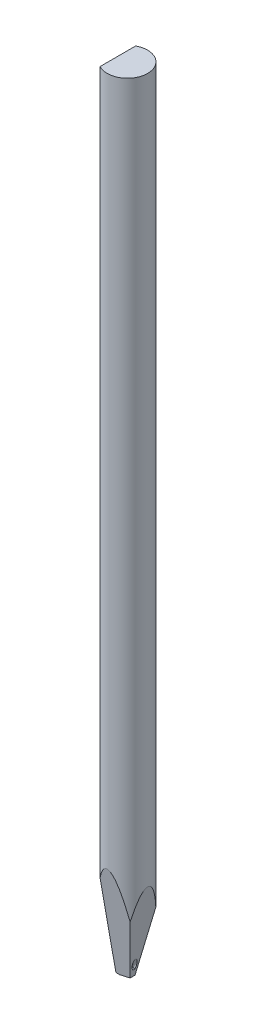
ISO-10303-21;
HEADER;
FILE_DESCRIPTION(('STEP AP214'),'2;1');
FILE_NAME('part.step','',(''),(''),'','','');
FILE_SCHEMA(('AUTOMOTIVE_DESIGN { 1 0 10303 214 1 1 1 1 }'));
ENDSEC;
DATA;
#1=APPLICATION_CONTEXT('core data for automotive mechanical design processes');
#2=APPLICATION_PROTOCOL_DEFINITION('international standard','automotive_design',2000,#1);
#3=PRODUCT_CONTEXT('',#1,'mechanical');
#4=PRODUCT('Part','Part','',(#3));
#5=PRODUCT_RELATED_PRODUCT_CATEGORY('part','',(#4));
#6=PRODUCT_DEFINITION_FORMATION('','',#4);
#7=PRODUCT_DEFINITION_CONTEXT('part definition',#1,'design');
#8=PRODUCT_DEFINITION('design','',#6,#7);
#9=PRODUCT_DEFINITION_SHAPE('','',#8);
#10=(LENGTH_UNIT() NAMED_UNIT(*) SI_UNIT(.MILLI.,.METRE.));
#11=(NAMED_UNIT(*) PLANE_ANGLE_UNIT() SI_UNIT($,.RADIAN.));
#12=(NAMED_UNIT(*) SI_UNIT($,.STERADIAN.) SOLID_ANGLE_UNIT());
#13=UNCERTAINTY_MEASURE_WITH_UNIT(LENGTH_MEASURE(1.E-05),#10,'distance_accuracy_value','');
#14=(GEOMETRIC_REPRESENTATION_CONTEXT(3) GLOBAL_UNCERTAINTY_ASSIGNED_CONTEXT((#13)) GLOBAL_UNIT_ASSIGNED_CONTEXT((#10,
#11,#12)) REPRESENTATION_CONTEXT('',''));
#15=CARTESIAN_POINT('',(0.,0.,0.));
#16=DIRECTION('',(0.,0.,1.));
#17=DIRECTION('',(1.,0.,0.));
#18=AXIS2_PLACEMENT_3D('',#15,#16,#17);
#19=CARTESIAN_POINT('',(39.4414537636428,0.,0.0762));
#20=DIRECTION('',(0.,-0.173648177666931,0.984807753012208));
#21=DIRECTION('',(0.,-0.984807753012208,-0.173648177666931));
#22=AXIS2_PLACEMENT_3D('',#19,#20,#21);
#23=PLANE('',#22);
#24=CARTESIAN_POINT('',(-0.32004,0.05588,0.086053151681989));
#25=DIRECTION('',(0.,-0.173648177666931,0.984807753012208));
#26=DIRECTION('',(0.,-0.984807753012208,-0.173648177666931));
#27=AXIS2_PLACEMENT_3D('',#24,#25,#26);
#28=ELLIPSE('',#27,0.0567420390721754,0.05588);
#29=CARTESIAN_POINT('',(-0.32004,0.,0.0761999999999999));
#30=VERTEX_POINT('',#29);
#31=CARTESIAN_POINT('',(-0.37592,0.05588,0.086053151681989));
#32=VERTEX_POINT('',#31);
#33=EDGE_CURVE('E358',#30,#32,#28,.F.);
#34=ORIENTED_EDGE('',*,*,#33,.F.);
#35=DIRECTION('',(-1.,0.,0.));
#36=VECTOR('',#35,1.);
#37=CARTESIAN_POINT('',(39.4414537636428,0.,0.0762));
#38=LINE('',#37,#36);
#39=CARTESIAN_POINT('',(-0.223520000000001,0.,0.0762000000000001));
#40=VERTEX_POINT('',#39);
#41=EDGE_CURVE('E420',#40,#30,#38,.T.);
#42=ORIENTED_EDGE('',*,*,#41,.F.);
#43=DIRECTION('',(-0.964921520309631,-0.258549942126377,-0.0455893306574928));
#44=VECTOR('',#43,1.);
#45=CARTESIAN_POINT('',(36.7074875502685,9.89563364876217,1.82106720348333));
#46=LINE('',#45,#44);
#47=CARTESIAN_POINT('',(0.203033220117547,0.114294590859393,0.0963532201175461));
#48=VERTEX_POINT('',#47);
#49=EDGE_CURVE('E417',#48,#40,#46,.T.);
#50=ORIENTED_EDGE('',*,*,#49,.F.);
#51=DIRECTION('',(-0.171087869746036,-0.970287525247814,-0.171087869746036));
#52=VECTOR('',#51,1.);
#53=CARTESIAN_POINT('',(1.33202003573172,6.51709699284012,1.22534003573172));
#54=LINE('',#53,#52);
#55=CARTESIAN_POINT('',(0.611163555974466,2.4289167446392,0.504483555974466));
#56=VERTEX_POINT('',#55);
#57=EDGE_CURVE('E414',#56,#48,#54,.T.);
#58=ORIENTED_EDGE('',*,*,#57,.F.);
#59=CARTESIAN_POINT('',(0.,-0.432151674654869,0.));
#60=DIRECTION('',(0.,-0.173648177666931,0.984807753012208));
#61=DIRECTION('',(0.,-0.984807753012208,-0.173648177666931));
#62=AXIS2_PLACEMENT_3D('',#59,#60,#61);
#63=ELLIPSE('',#62,4.56371043248163,0.792479999999998);
#64=CARTESIAN_POINT('',(-0.37592,3.52439037249585,0.69764511322018));
#65=VERTEX_POINT('',#64);
#66=EDGE_CURVE('E425',#56,#65,#63,.T.);
#67=ORIENTED_EDGE('',*,*,#66,.T.);
#68=DIRECTION('',(0.,0.984807753012208,0.173648177666931));
#69=VECTOR('',#68,1.);
#70=CARTESIAN_POINT('',(-0.37592,30.0265048215283,5.37068293640828));
#71=LINE('',#70,#69);
#72=EDGE_CURVE('E440',#32,#65,#71,.T.);
#73=ORIENTED_EDGE('',*,*,#72,.F.);
#74=EDGE_LOOP('',(#34,#42,#50,#58,#67,#73));
#75=FACE_BOUND('',#74,.T.);
#76=ADVANCED_FACE('F46',(#75),#23,.T.);
#77=CARTESIAN_POINT('',(39.4414537636428,0.,-0.0762));
#78=DIRECTION('',(0.,-0.173648177666931,-0.984807753012208));
#79=DIRECTION('',(0.,0.984807753012208,-0.173648177666931));
#80=AXIS2_PLACEMENT_3D('',#77,#78,#79);
#81=PLANE('',#80);
#82=CARTESIAN_POINT('',(-0.32004,0.05588,-0.086053151681989));
#83=DIRECTION('',(0.,-0.173648177666931,-0.984807753012208));
#84=DIRECTION('',(0.,0.984807753012208,-0.173648177666931));
#85=AXIS2_PLACEMENT_3D('',#82,#83,#84);
#86=ELLIPSE('',#85,0.0567420390721754,0.05588);
#87=CARTESIAN_POINT('',(-0.37592,0.05588,-0.086053151681989));
#88=VERTEX_POINT('',#87);
#89=CARTESIAN_POINT('',(-0.32004,0.,-0.0761999999999999));
#90=VERTEX_POINT('',#89);
#91=EDGE_CURVE('E463',#88,#90,#86,.F.);
#92=ORIENTED_EDGE('',*,*,#91,.F.);
#93=DIRECTION('',(0.,-0.984807753012208,0.173648177666931));
#94=VECTOR('',#93,1.);
#95=CARTESIAN_POINT('',(-0.37592,30.3009691393038,-5.41907840087385));
#96=LINE('',#95,#94);
#97=CARTESIAN_POINT('',(-0.37592,3.52439037249586,-0.69764511322018));
#98=VERTEX_POINT('',#97);
#99=EDGE_CURVE('E442',#98,#88,#96,.T.);
#100=ORIENTED_EDGE('',*,*,#99,.F.);
#101=CARTESIAN_POINT('',(0.,-0.432151674654869,0.));
#102=DIRECTION('',(0.,-0.173648177666931,-0.984807753012208));
#103=DIRECTION('',(0.,-0.984807753012208,0.173648177666931));
#104=AXIS2_PLACEMENT_3D('',#101,#102,#103);
#105=ELLIPSE('',#104,4.56371043248163,0.792479999999998);
#106=CARTESIAN_POINT('',(0.611163555974466,2.4289167446392,-0.504483555974466));
#107=VERTEX_POINT('',#106);
#108=EDGE_CURVE('E428',#98,#107,#105,.T.);
#109=ORIENTED_EDGE('',*,*,#108,.T.);
#110=DIRECTION('',(0.171087869746036,0.970287525247814,-0.171087869746036));
#111=VECTOR('',#110,1.);
#112=CARTESIAN_POINT('',(1.33202003573172,6.51709699284012,-1.22534003573172));
#113=LINE('',#112,#111);
#114=CARTESIAN_POINT('',(0.203033220117547,0.114294590859393,-0.0963532201175461));
#115=VERTEX_POINT('',#114);
#116=EDGE_CURVE('E445',#115,#107,#113,.T.);
#117=ORIENTED_EDGE('',*,*,#116,.F.);
#118=DIRECTION('',(0.964921520309631,0.258549942126377,-0.0455893306574928));
#119=VECTOR('',#118,1.);
#120=CARTESIAN_POINT('',(36.7074875502685,9.89563364876217,-1.82106720348333));
#121=LINE('',#120,#119);
#122=CARTESIAN_POINT('',(-0.223520000000001,0.,-0.0762000000000001));
#123=VERTEX_POINT('',#122);
#124=EDGE_CURVE('E448',#123,#115,#121,.T.);
#125=ORIENTED_EDGE('',*,*,#124,.F.);
#126=DIRECTION('',(-1.,0.,0.));
#127=VECTOR('',#126,1.);
#128=CARTESIAN_POINT('',(39.4414537636428,0.,-0.0762));
#129=LINE('',#128,#127);
#130=EDGE_CURVE('E422',#123,#90,#129,.T.);
#131=ORIENTED_EDGE('',*,*,#130,.T.);
#132=EDGE_LOOP('',(#92,#100,#109,#117,#125,#131));
#133=FACE_BOUND('',#132,.T.);
#134=ADVANCED_FACE('F261',(#133),#81,.T.);
#135=CARTESIAN_POINT('',(39.2509537636428,-0.217680032,0.));
#136=DIRECTION('',(-1.,0.,0.));
#137=DIRECTION('',(0.,0.,1.));
#138=AXIS2_PLACEMENT_3D('',#135,#136,#137);
#139=CYLINDRICAL_SURFACE('',#138,0.22352);
#140=DIRECTION('',(-1.,0.,0.));
#141=VECTOR('',#140,1.);
#142=CARTESIAN_POINT('',(39.2509537636428,0.,0.0507601622188008));
#143=LINE('',#142,#141);
#144=CARTESIAN_POINT('',(-0.223519999999998,0.,0.0507601622188008));
#145=VERTEX_POINT('',#144);
#146=CARTESIAN_POINT('',(-0.32004,0.,0.0507601622187993));
#147=VERTEX_POINT('',#146);
#148=EDGE_CURVE('E226',#145,#147,#143,.T.);
#149=ORIENTED_EDGE('',*,*,#148,.T.);
#150=CARTESIAN_POINT('',(-0.32004,0.,0.0507601622188009));
#151=CARTESIAN_POINT('',(-0.320809475439347,-5.41041296015965E-07,0.0507620071604706));
#152=CARTESIAN_POINT('',(-0.321576800282668,1.5871895672045E-05,0.050692115938631));
#153=CARTESIAN_POINT('',(-0.323080877945855,7.79165019076629E-05,0.0504251621910984));
#154=CARTESIAN_POINT('',(-0.323817846077235,0.000123279767180408,0.0502292677351534));
#155=CARTESIAN_POINT('',(-0.325247431761082,0.000238505043902202,0.0497268831541668));
#156=CARTESIAN_POINT('',(-0.32594018272157,0.000308288799525646,0.0494207462128683));
#157=CARTESIAN_POINT('',(-0.327276847370732,0.000466504775771173,0.0487176644362897));
#158=CARTESIAN_POINT('',(-0.327920638607172,0.000554981790321569,0.0483205012810623));
#159=CARTESIAN_POINT('',(-0.329593275221739,0.000812282763806549,0.0471472618074019));
#160=CARTESIAN_POINT('',(-0.330571678746111,0.000993612063422425,0.0463021208742925));
#161=CARTESIAN_POINT('',(-0.332385248633484,0.00137286068933092,0.04447365071426));
#162=CARTESIAN_POINT('',(-0.333219984012656,0.00157082736981463,0.0434899212585391));
#163=CARTESIAN_POINT('',(-0.335345578252586,0.00211859988673764,0.0406581114295598));
#164=CARTESIAN_POINT('',(-0.336508686454995,0.00247087329222261,0.0387153496579219));
#165=CARTESIAN_POINT('',(-0.33854573765277,0.00314258983066577,0.0346815872372509));
#166=CARTESIAN_POINT('',(-0.339418997502717,0.0034619541966496,0.0325902502855744));
#167=CARTESIAN_POINT('',(-0.341596334336846,0.00430206882658854,0.0264787227515104));
#168=CARTESIAN_POINT('',(-0.342622185401764,0.00475887805797586,0.0223509389944154));
#169=CARTESIAN_POINT('',(-0.344107303512625,0.00544265456112021,0.0139757220926114));
#170=CARTESIAN_POINT('',(-0.34456488861004,0.00566893917471365,0.00972797163831547));
#171=CARTESIAN_POINT('',(-0.345004758810726,0.00588589993718082,0.000852646654595291));
#172=CARTESIAN_POINT('',(-0.344945012421054,0.00585574451986179,-0.00377752303026068));
#173=CARTESIAN_POINT('',(-0.344240777632389,0.00551043791740716,-0.0129683265767084));
#174=CARTESIAN_POINT('',(-0.343598877957902,0.00519654846373034,-0.0175291774761781));
#175=CARTESIAN_POINT('',(-0.342186290137468,0.0045741223651413,-0.023826542249816));
#176=CARTESIAN_POINT('',(-0.341714874305335,0.00437162733718365,-0.0256422391028256));
#177=CARTESIAN_POINT('',(-0.340627957746504,0.00392750723650701,-0.0292328652612556));
#178=CARTESIAN_POINT('',(-0.340011976430116,0.00368575249410048,-0.0310076364173655));
#179=CARTESIAN_POINT('',(-0.338407729485797,0.0030960667307467,-0.0349891355893685));
#180=CARTESIAN_POINT('',(-0.33736331269008,0.00273766008525308,-0.0371721555483447));
#181=CARTESIAN_POINT('',(-0.334905960523153,0.00199828653899547,-0.041315195895506));
#182=CARTESIAN_POINT('',(-0.333495616225528,0.00161749226507164,-0.0432766503272211));
#183=CARTESIAN_POINT('',(-0.331200806954028,0.00112210848421275,-0.0456870946574725));
#184=CARTESIAN_POINT('',(-0.33052257932814,0.000987199146508853,-0.046327180625344));
#185=CARTESIAN_POINT('',(-0.329085205149441,0.000732066396515359,-0.0475153538951638));
#186=CARTESIAN_POINT('',(-0.328326017912602,0.00061185043371845,-0.0480633945827042));
#187=CARTESIAN_POINT('',(-0.326716292347034,0.000394246892643618,-0.0490413681859921));
#188=CARTESIAN_POINT('',(-0.32586466388685,0.000297187662007648,-0.0494696156608001));
#189=CARTESIAN_POINT('',(-0.324093197121016,0.000140193099000938,-0.0501564294225165));
#190=CARTESIAN_POINT('',(-0.323173640938966,8.01129292474691E-05,-0.0504156579526773));
#191=CARTESIAN_POINT('',(-0.321874914124203,2.89381809600572E-05,-0.0506359338031454));
#192=CARTESIAN_POINT('',(-0.32150984236334,1.81302289830031E-05,-0.050682362340871));
#193=CARTESIAN_POINT('',(-0.32077659939215,3.65242935722097E-06,-0.0507445040489149));
#194=CARTESIAN_POINT('',(-0.320408425496098,-1.04159337815038E-08,-0.0507601870880603));
#195=CARTESIAN_POINT('',(-0.320040000000259,0.,-0.0507601622203182));
#196=B_SPLINE_CURVE_WITH_KNOTS('',3,(#150,#151,#152,#153,#154,#155,#156,#157,#158,#159,#160,
#161,#162,#163,#164,#165,#166,#167,#168,#169,#170,#171,#172,#173,#174,#175,#176,#177,#178,#179,
#180,#181,#182,#183,#184,#185,#186,#187,#188,#189,#190,#191,#192,#193,#194,#195),.UNSPECIFIED.,
.F.,.F.,(4,2,2,2,2,2,2,2,2,2,2,2,2,2,2,2,2,2,2,2,2,2,4),(0.,0.00230166702394006,
0.00458229886576195,0.00685568831982713,0.00913458848021843,0.0130284670320873,
0.016933830425893,0.0237697103353728,0.0306215892230504,0.0433843744426046,0.0561848454987028,
0.0700344921085309,0.0838228523462301,0.089478541101295,0.0951533046761938,0.102471060476781,
0.109738351075717,0.112559031674474,0.115381136468608,0.118241150761547,0.121089890625289,
0.122193253621969,0.123297697395864),.UNSPECIFIED.);
#197=CARTESIAN_POINT('',(-0.341569991325016,0.00431417921200177,0.0260574382161684));
#198=VERTEX_POINT('',#197);
#199=EDGE_CURVE('E224',#147,#198,#196,.T.);
#200=ORIENTED_EDGE('',*,*,#199,.T.);
#201=CARTESIAN_POINT('',(-0.37592,0.,-0.0507601622188007));
#202=CARTESIAN_POINT('',(-0.350517897671708,0.00387563047875049,-0.0341398968422236));
#203=CARTESIAN_POINT('',(-0.325119999999998,0.00583996800000001,-0.0170689128963833));
#204=CARTESIAN_POINT('',(-0.325119999999998,0.005839968,0.0170689128963834));
#205=CARTESIAN_POINT('',(-0.350517897671708,0.00387563047875052,0.0341398968422234));
#206=CARTESIAN_POINT('',(-0.37592,0.,0.0507601622188008));
#207=(BOUNDED_CURVE() B_SPLINE_CURVE(3,(#201,#202,#203,#204,#205,#206),.UNSPECIFIED.,.F.,
.F.) B_SPLINE_CURVE_WITH_KNOTS((4,2,4),(1.34170313821549,1.5707963267949,1.7998895153743),
.UNSPECIFIED.) CURVE() GEOMETRIC_REPRESENTATION_ITEM() RATIONAL_B_SPLINE_CURVE((1.,1.,1.,1.,1.,1.)) REPRESENTATION_ITEM(''));
#208=CARTESIAN_POINT('',(-0.341570424931193,0.00431507737605475,-0.0260571786900659));
#209=VERTEX_POINT('',#208);
#210=EDGE_CURVE('E213',#198,#209,#207,.F.);
#211=ORIENTED_EDGE('',*,*,#210,.T.);
#212=CARTESIAN_POINT('',(-0.32004,0.,-0.0507601622187993));
#213=VERTEX_POINT('',#212);
#214=EDGE_CURVE('E227',#209,#213,#196,.T.);
#215=ORIENTED_EDGE('',*,*,#214,.T.);
#216=DIRECTION('',(-1.,0.,0.));
#217=VECTOR('',#216,1.);
#218=CARTESIAN_POINT('',(39.2509537636428,0.,-0.0507601622188009));
#219=LINE('',#218,#217);
#220=CARTESIAN_POINT('',(-0.22352,0.,-0.0507601622187909));
#221=VERTEX_POINT('',#220);
#222=EDGE_CURVE('E299',#221,#213,#219,.T.);
#223=ORIENTED_EDGE('',*,*,#222,.F.);
#224=CARTESIAN_POINT('',(-1.03591293921722,-0.217680032,0.));
#225=DIRECTION('',(-0.258819045102522,0.965925826289068,0.));
#226=DIRECTION('',(-0.965925826289068,-0.258819045102522,0.));
#227=AXIS2_PLACEMENT_3D('',#224,#225,#226);
#228=ELLIPSE('',#227,0.863614962768528,0.22352);
#229=CARTESIAN_POINT('',(-0.21260720632451,0.00292407425251634,-0.0359863683153587));
#230=VERTEX_POINT('',#229);
#231=EDGE_CURVE('E450',#230,#221,#228,.T.);
#232=ORIENTED_EDGE('',*,*,#231,.F.);
#233=CARTESIAN_POINT('',(-0.200679772365681,0.00257805575643269,-0.0380468813160764));
#234=CARTESIAN_POINT('',(-0.203236281086819,0.00259681610478001,-0.0379307129945415));
#235=CARTESIAN_POINT('',(-0.20578763073782,0.00265241023420206,-0.0376154914849817));
#236=CARTESIAN_POINT('',(-0.210815610182838,0.00282831237674686,-0.0365745620891434));
#237=CARTESIAN_POINT('',(-0.213291799770585,0.00294894437521597,-0.035846798186715));
#238=CARTESIAN_POINT('',(-0.218086714182621,0.00324614492953906,-0.0339658644914402));
#239=CARTESIAN_POINT('',(-0.220404817441722,0.00342292037866237,-0.0328111186074336));
#240=CARTESIAN_POINT('',(-0.224776468273895,0.00380971561444363,-0.0300893083720762));
#241=CARTESIAN_POINT('',(-0.226830640788004,0.00401965414441562,-0.0285232457767758));
#242=CARTESIAN_POINT('',(-0.230396900654561,0.00442144881246551,-0.0251919332329743));
#243=CARTESIAN_POINT('',(-0.23194279985924,0.0046129866444759,-0.0234628410940604));
#244=CARTESIAN_POINT('',(-0.234689041383704,0.00497390416758029,-0.0197455957490929));
#245=CARTESIAN_POINT('',(-0.235889400251015,0.00514328491953924,-0.017757454955206));
#246=CARTESIAN_POINT('',(-0.237804648185127,0.00542340884420199,-0.0137722515555761));
#247=CARTESIAN_POINT('',(-0.238553077925492,0.00553801251190657,-0.0117915212336279));
#248=CARTESIAN_POINT('',(-0.239693801133062,0.00571556399173786,-0.00772815406954845));
#249=CARTESIAN_POINT('',(-0.240086244188377,0.00577853349983257,-0.00564556041918781));
#250=CARTESIAN_POINT('',(-0.240492497870672,0.0058437928827583,-0.00153161186614157));
#251=CARTESIAN_POINT('',(-0.240521531211606,0.00584852221441453,0.00049821692076211));
#252=CARTESIAN_POINT('',(-0.240239376379623,0.00580309721592026,0.00453333125549054));
#253=CARTESIAN_POINT('',(-0.239928222952504,0.00575294849087208,0.00653861928869277));
#254=CARTESIAN_POINT('',(-0.238980342691819,0.00560409268320814,0.0104493114527362));
#255=CARTESIAN_POINT('',(-0.23834658811889,0.00550582921137548,0.0123554553595016));
#256=CARTESIAN_POINT('',(-0.236775624088955,0.00527164480976626,0.0160357188081737));
#257=CARTESIAN_POINT('',(-0.235838381412654,0.00513571975785178,0.017809823871175));
#258=CARTESIAN_POINT('',(-0.233671348682005,0.00483796201114088,0.0212109082486344));
#259=CARTESIAN_POINT('',(-0.232436706573884,0.00467571597171769,0.0228347538174076));
#260=CARTESIAN_POINT('',(-0.229723977588322,0.00434400500683798,0.0258619432371927));
#261=CARTESIAN_POINT('',(-0.22824594404034,0.00417454166877952,0.0272653352604181));
#262=CARTESIAN_POINT('',(-0.225014589813873,0.0038368312731957,0.0298882741315758));
#263=CARTESIAN_POINT('',(-0.223251465208781,0.00366903245564858,0.0310957736567399));
#264=CARTESIAN_POINT('',(-0.219556608271507,0.00335914893569759,0.0332268658738614));
#265=CARTESIAN_POINT('',(-0.217624609680811,0.00321710596650307,0.0341499994581288));
#266=CARTESIAN_POINT('',(-0.213252542105084,0.0029469915206067,0.0358586942323145));
#267=CARTESIAN_POINT('',(-0.210787403171104,0.00282719628668196,0.0365812466817848));
#268=CARTESIAN_POINT('',(-0.205776075165683,0.00265214241400254,0.0376170305540467));
#269=CARTESIAN_POINT('',(-0.203230100329751,0.0025967257853786,0.0379312642471438));
#270=CARTESIAN_POINT('',(-0.200679772365681,0.00257805575643266,0.0380468813160764));
#271=B_SPLINE_CURVE_WITH_KNOTS('',3,(#233,#234,#235,#236,#237,#238,#239,#240,#241,#242,#243,
#244,#245,#246,#247,#248,#249,#250,#251,#252,#253,#254,#255,#256,#257,#258,#259,#260,#261,#262,
#263,#264,#265,#266,#267,#268,#269,#270),.UNSPECIFIED.,.F.,.F.,(4,2,2,2,2,2,2,2,2,2,2,2,2,2,2,2,
2,2,4),(0.,0.00767634807286407,0.0153912939488547,0.0231350065153629,0.0308600315021418,
0.0378038630914243,0.0447473620932904,0.0510769180534984,0.0574038130559887,0.0634647511028258,
0.0695250701589517,0.0755305371600927,0.0815366617318609,0.0876483446303212,0.0937586901764232,
0.10016212779788,0.106575850205475,0.114254113093285,0.121913492881875),.UNSPECIFIED.);
#272=CARTESIAN_POINT('',(-0.239654443499841,0.00571004387625628,-0.00762));
#273=VERTEX_POINT('',#272);
#274=EDGE_CURVE('E270',#230,#273,#271,.T.);
#275=ORIENTED_EDGE('',*,*,#274,.T.);
#276=DIRECTION('',(-1.,0.,0.));
#277=VECTOR('',#276,1.);
#278=CARTESIAN_POINT('',(39.2509537636428,0.00571004387625731,-0.00762));
#279=LINE('',#278,#277);
#280=CARTESIAN_POINT('',(-0.248214270242539,0.0057100438762565,-0.00762));
#281=VERTEX_POINT('',#280);
#282=EDGE_CURVE('E341',#281,#273,#279,.F.);
#283=ORIENTED_EDGE('',*,*,#282,.F.);
#284=CARTESIAN_POINT('',(-0.861973459442812,-0.217680032,0.));
#285=DIRECTION('',(-0.342020143325664,0.93969262078591,0.));
#286=DIRECTION('',(-0.93969262078591,-0.342020143325664,0.));
#287=AXIS2_PLACEMENT_3D('',#284,#285,#286);
#288=ELLIPSE('',#287,0.653528759524463,0.22352);
#289=CARTESIAN_POINT('',(-0.248214270242539,0.0057100438762565,0.00762));
#290=VERTEX_POINT('',#289);
#291=EDGE_CURVE('E367',#281,#290,#288,.F.);
#292=ORIENTED_EDGE('',*,*,#291,.T.);
#293=DIRECTION('',(-1.,0.,0.));
#294=VECTOR('',#293,1.);
#295=CARTESIAN_POINT('',(39.2509537636428,0.00571004387625731,0.00762));
#296=LINE('',#295,#294);
#297=CARTESIAN_POINT('',(-0.239654443499841,0.00571004387625628,0.00762));
#298=VERTEX_POINT('',#297);
#299=EDGE_CURVE('E363',#290,#298,#296,.F.);
#300=ORIENTED_EDGE('',*,*,#299,.T.);
#301=CARTESIAN_POINT('',(-0.212607206324503,0.00292407425251729,0.0359863683153509));
#302=VERTEX_POINT('',#301);
#303=EDGE_CURVE('E453',#298,#302,#271,.T.);
#304=ORIENTED_EDGE('',*,*,#303,.T.);
#305=EDGE_CURVE('E451',#145,#302,#228,.T.);
#306=ORIENTED_EDGE('',*,*,#305,.F.);
#307=EDGE_LOOP('',(#149,#200,#211,#215,#223,#232,#275,#283,#292,#300,#304,#306));
#308=FACE_BOUND('',#307,.T.);
#309=ADVANCED_FACE('F225',(#308),#139,.F.);
#310=CARTESIAN_POINT('',(-0.0854612741559006,0.19812,0.));
#311=DIRECTION('',(-0.500000000000004,-0.866025403784436,0.));
#312=DIRECTION('',(0.866025403784436,-0.500000000000004,0.));
#313=AXIS2_PLACEMENT_3D('',#310,#311,#312);
#314=CYLINDRICAL_SURFACE('',#313,0.0381);
#315=DIRECTION('',(-0.500000000000004,-0.866025403784436,0.));
#316=VECTOR('',#315,1.);
#317=CARTESIAN_POINT('',(-0.117790196191749,0.216785111840008,-0.00762));
#318=LINE('',#317,#316);
#319=CARTESIAN_POINT('',(-0.238502486856642,0.0077052913103933,-0.00762));
#320=VERTEX_POINT('',#319);
#321=EDGE_CURVE('E220',#273,#320,#318,.F.);
#322=ORIENTED_EDGE('',*,*,#321,.F.);
#323=ORIENTED_EDGE('',*,*,#274,.F.);
#324=CARTESIAN_POINT('',(-0.195513250218263,0.0075043859866371,0.));
#325=DIRECTION('',(-0.258819045102522,0.965925826289068,0.));
#326=DIRECTION('',(-0.965925826289068,-0.258819045102522,0.));
#327=AXIS2_PLACEMENT_3D('',#324,#325,#326);
#328=ELLIPSE('',#327,0.0538815367264152,0.0381);
#329=CARTESIAN_POINT('',(-0.195513250218263,0.00750438598663718,-0.0380999999999996));
#330=VERTEX_POINT('',#329);
#331=EDGE_CURVE('E316',#330,#230,#328,.T.);
#332=ORIENTED_EDGE('',*,*,#331,.F.);
#333=DIRECTION('',(0.500000000000004,0.866025403784436,0.));
#334=VECTOR('',#333,1.);
#335=CARTESIAN_POINT('',(-0.0854612741559006,0.19812,-0.0381));
#336=LINE('',#335,#334);
#337=CARTESIAN_POINT('',(-0.0854612741559006,0.19812,-0.0381));
#338=VERTEX_POINT('',#337);
#339=EDGE_CURVE('E403',#330,#338,#336,.T.);
#340=ORIENTED_EDGE('',*,*,#339,.T.);
#341=CARTESIAN_POINT('',(-0.0854612741559006,0.19812,0.));
#342=DIRECTION('',(0.,-1.,0.));
#343=DIRECTION('',(-1.,0.,0.));
#344=AXIS2_PLACEMENT_3D('',#341,#342,#343);
#345=ELLIPSE('',#344,0.0439940905122496,0.0381);
#346=CARTESIAN_POINT('',(-0.0854612741559006,0.19812,0.0381));
#347=VERTEX_POINT('',#346);
#348=EDGE_CURVE('E405',#338,#347,#345,.F.);
#349=ORIENTED_EDGE('',*,*,#348,.T.);
#350=DIRECTION('',(-0.500000000000004,-0.866025403784436,0.));
#351=VECTOR('',#350,1.);
#352=CARTESIAN_POINT('',(-0.149884432115812,0.0865358172293992,0.0381));
#353=LINE('',#352,#351);
#354=CARTESIAN_POINT('',(-0.195513250218263,0.00750438598663713,0.0380999999999996));
#355=VERTEX_POINT('',#354);
#356=EDGE_CURVE('E394',#347,#355,#353,.T.);
#357=ORIENTED_EDGE('',*,*,#356,.T.);
#358=EDGE_CURVE('E312',#302,#355,#328,.T.);
#359=ORIENTED_EDGE('',*,*,#358,.F.);
#360=ORIENTED_EDGE('',*,*,#303,.F.);
#361=DIRECTION('',(-0.500000000000004,-0.866025403784436,0.));
#362=VECTOR('',#361,1.);
#363=CARTESIAN_POINT('',(-0.117790196191749,0.216785111840008,0.00762));
#364=LINE('',#363,#362);
#365=CARTESIAN_POINT('',(-0.238502486856642,0.00770529131039339,0.00762));
#366=VERTEX_POINT('',#365);
#367=EDGE_CURVE('E326',#298,#366,#364,.F.);
#368=ORIENTED_EDGE('',*,*,#367,.T.);
#369=CARTESIAN_POINT('',(-0.238502486856642,-0.0669551560496373,0.));
#370=DIRECTION('',(1.,0.,0.));
#371=DIRECTION('',(0.,-1.,0.));
#372=AXIS2_PLACEMENT_3D('',#369,#370,#371);
#373=ELLIPSE('',#372,0.0761999999999994,0.0381);
#374=CARTESIAN_POINT('',(-0.238502486856642,0.00924484395036231,0.));
#375=VERTEX_POINT('',#374);
#376=EDGE_CURVE('E328',#366,#375,#373,.F.);
#377=ORIENTED_EDGE('',*,*,#376,.T.);
#378=EDGE_CURVE('E330',#375,#320,#373,.F.);
#379=ORIENTED_EDGE('',*,*,#378,.T.);
#380=EDGE_LOOP('',(#322,#323,#332,#340,#349,#357,#359,#360,#368,#377,#379));
#381=FACE_BOUND('',#380,.T.);
#382=ADVANCED_FACE('F260',(#381),#314,.F.);
#383=CARTESIAN_POINT('',(0.,0.,0.));
#384=DIRECTION('',(0.,1.,0.));
#385=DIRECTION('',(0.,0.,1.));
#386=AXIS2_PLACEMENT_3D('',#383,#384,#385);
#387=PLANE('',#386);
#388=ORIENTED_EDGE('',*,*,#41,.T.);
#389=DIRECTION('',(0.,0.,-1.));
#390=VECTOR('',#389,1.);
#391=CARTESIAN_POINT('',(-0.32004,0.,39.0414761789886));
#392=LINE('',#391,#390);
#393=EDGE_CURVE('E79',#30,#147,#392,.T.);
#394=ORIENTED_EDGE('',*,*,#393,.T.);
#395=ORIENTED_EDGE('',*,*,#148,.F.);
#396=DIRECTION('',(0.,0.,-1.));
#397=VECTOR('',#396,1.);
#398=CARTESIAN_POINT('',(-0.22352,0.,39.843610155168));
#399=LINE('',#398,#397);
#400=EDGE_CURVE('E408',#40,#145,#399,.T.);
#401=ORIENTED_EDGE('',*,*,#400,.F.);
#402=EDGE_LOOP('',(#388,#394,#395,#401));
#403=FACE_BOUND('',#402,.T.);
#404=ADVANCED_FACE('F469',(#403),#387,.F.);
#405=ORIENTED_EDGE('',*,*,#222,.T.);
#406=EDGE_CURVE('E460',#213,#90,#392,.T.);
#407=ORIENTED_EDGE('',*,*,#406,.T.);
#408=ORIENTED_EDGE('',*,*,#130,.F.);
#409=EDGE_CURVE('E308',#221,#123,#399,.T.);
#410=ORIENTED_EDGE('',*,*,#409,.F.);
#411=EDGE_LOOP('',(#405,#407,#408,#410));
#412=FACE_BOUND('',#411,.T.);
#413=ADVANCED_FACE('F459',(#412),#387,.F.);
#414=CARTESIAN_POINT('',(0.,31.115,0.));
#415=DIRECTION('',(0.,-1.,0.));
#416=DIRECTION('',(0.,0.,-1.));
#417=AXIS2_PLACEMENT_3D('',#414,#415,#416);
#418=CYLINDRICAL_SURFACE('',#417,0.792479999999998);
#419=ORIENTED_EDGE('',*,*,#66,.F.);
#420=CARTESIAN_POINT('',(0.,-1.03716401917168,0.));
#421=DIRECTION('',(-0.984807753012208,0.173648177666931,0.));
#422=DIRECTION('',(-0.173648177666931,-0.984807753012208,0.));
#423=AXIS2_PLACEMENT_3D('',#420,#421,#422);
#424=ELLIPSE('',#423,4.56371043248165,0.792479999999998);
#425=EDGE_CURVE('E411',#56,#107,#424,.T.);
#426=ORIENTED_EDGE('',*,*,#425,.T.);
#427=ORIENTED_EDGE('',*,*,#108,.F.);
#428=DIRECTION('',(0.,-1.,0.));
#429=VECTOR('',#428,1.);
#430=CARTESIAN_POINT('',(-0.37592,31.115,-0.69764511322018));
#431=LINE('',#430,#429);
#432=CARTESIAN_POINT('',(-0.37592,31.115,-0.69764511322018));
#433=VERTEX_POINT('',#432);
#434=EDGE_CURVE('E434',#433,#98,#431,.T.);
#435=ORIENTED_EDGE('',*,*,#434,.F.);
#436=CARTESIAN_POINT('',(0.,31.115,0.));
#437=DIRECTION('',(0.,1.,0.));
#438=DIRECTION('',(0.,0.,1.));
#439=AXIS2_PLACEMENT_3D('',#436,#437,#438);
#440=CIRCLE('',#439,0.792479999999998);
#441=CARTESIAN_POINT('',(-0.37592,31.115,0.69764511322018));
#442=VERTEX_POINT('',#441);
#443=EDGE_CURVE('E437',#442,#433,#440,.T.);
#444=ORIENTED_EDGE('',*,*,#443,.F.);
#445=DIRECTION('',(0.,-1.,0.));
#446=VECTOR('',#445,1.);
#447=CARTESIAN_POINT('',(-0.37592,31.115,0.69764511322018));
#448=LINE('',#447,#446);
#449=EDGE_CURVE('E432',#65,#442,#448,.F.);
#450=ORIENTED_EDGE('',*,*,#449,.F.);
#451=EDGE_LOOP('',(#419,#426,#427,#435,#444,#450));
#452=FACE_BOUND('',#451,.T.);
#453=ADVANCED_FACE('F476',(#452),#418,.T.);
#454=CARTESIAN_POINT('',(-0.37592,31.115,-0.80247998));
#455=DIRECTION('',(-1.,0.,0.));
#456=DIRECTION('',(0.,0.,1.));
#457=AXIS2_PLACEMENT_3D('',#454,#455,#456);
#458=PLANE('',#457);
#459=DIRECTION('',(0.,0.,-1.));
#460=VECTOR('',#459,1.);
#461=CARTESIAN_POINT('',(-0.37592,0.05588,39.0414761789886));
#462=LINE('',#461,#460);
#463=CARTESIAN_POINT('',(-0.37592,0.0558840167202514,-0.00162024618560986));
#464=VERTEX_POINT('',#463);
#465=EDGE_CURVE('E71',#32,#464,#462,.T.);
#466=ORIENTED_EDGE('',*,*,#465,.F.);
#467=ORIENTED_EDGE('',*,*,#72,.T.);
#468=ORIENTED_EDGE('',*,*,#449,.T.);
#469=DIRECTION('',(0.,0.,-1.));
#470=VECTOR('',#469,1.);
#471=CARTESIAN_POINT('',(-0.37592,31.115,-0.80247998));
#472=LINE('',#471,#470);
#473=EDGE_CURVE('E430',#442,#433,#472,.T.);
#474=ORIENTED_EDGE('',*,*,#473,.T.);
#475=ORIENTED_EDGE('',*,*,#434,.T.);
#476=ORIENTED_EDGE('',*,*,#99,.T.);
#477=EDGE_CURVE('E465',#464,#88,#462,.T.);
#478=ORIENTED_EDGE('',*,*,#477,.F.);
#479=EDGE_LOOP('',(#466,#467,#468,#474,#475,#476,#478));
#480=FACE_BOUND('',#479,.T.);
#481=ADVANCED_FACE('F482',(#480),#458,.T.);
#482=CARTESIAN_POINT('',(0.,31.115,0.));
#483=DIRECTION('',(0.,1.,0.));
#484=DIRECTION('',(0.,0.,1.));
#485=AXIS2_PLACEMENT_3D('',#482,#483,#484);
#486=PLANE('',#485);
#487=ORIENTED_EDGE('',*,*,#443,.T.);
#488=ORIENTED_EDGE('',*,*,#473,.F.);
#489=EDGE_LOOP('',(#487,#488));
#490=FACE_BOUND('',#489,.T.);
#491=ADVANCED_FACE('F484',(#490),#486,.T.);
#492=CARTESIAN_POINT('',(-0.22352,0.,39.843610155168));
#493=DIRECTION('',(-0.258819045102522,0.965925826289068,0.));
#494=DIRECTION('',(-0.965925826289068,-0.258819045102522,0.));
#495=AXIS2_PLACEMENT_3D('',#492,#493,#494);
#496=PLANE('',#495);
#497=ORIENTED_EDGE('',*,*,#305,.T.);
#498=ORIENTED_EDGE('',*,*,#358,.T.);
#499=DIRECTION('',(-0.965925826289068,-0.258819045102522,0.));
#500=VECTOR('',#499,1.);
#501=CARTESIAN_POINT('',(-0.22352,0.,0.0380999999999992));
#502=LINE('',#501,#500);
#503=CARTESIAN_POINT('',(0.01016,0.062614367287305,0.0380999999999996));
#504=VERTEX_POINT('',#503);
#505=EDGE_CURVE('E324',#504,#355,#502,.T.);
#506=ORIENTED_EDGE('',*,*,#505,.F.);
#507=DIRECTION('',(0.,0.,1.));
#508=VECTOR('',#507,1.);
#509=CARTESIAN_POINT('',(0.0101599999999999,0.062614367287305,39.843610155168));
#510=LINE('',#509,#508);
#511=CARTESIAN_POINT('',(0.01016,0.062614367287305,-0.0380999999999996));
#512=VERTEX_POINT('',#511);
#513=EDGE_CURVE('E322',#512,#504,#510,.T.);
#514=ORIENTED_EDGE('',*,*,#513,.F.);
#515=DIRECTION('',(-0.965925826289068,-0.258819045102522,0.));
#516=VECTOR('',#515,1.);
#517=CARTESIAN_POINT('',(-0.22352,0.,-0.0380999999999992));
#518=LINE('',#517,#516);
#519=EDGE_CURVE('E319',#512,#330,#518,.T.);
#520=ORIENTED_EDGE('',*,*,#519,.T.);
#521=ORIENTED_EDGE('',*,*,#331,.T.);
#522=ORIENTED_EDGE('',*,*,#231,.T.);
#523=ORIENTED_EDGE('',*,*,#409,.T.);
#524=ORIENTED_EDGE('',*,*,#124,.T.);
#525=DIRECTION('',(0.,0.,-1.));
#526=VECTOR('',#525,1.);
#527=CARTESIAN_POINT('',(0.203033220117546,0.114294590859392,39.843610155168));
#528=LINE('',#527,#526);
#529=EDGE_CURVE('E301',#48,#115,#528,.T.);
#530=ORIENTED_EDGE('',*,*,#529,.F.);
#531=ORIENTED_EDGE('',*,*,#49,.T.);
#532=ORIENTED_EDGE('',*,*,#400,.T.);
#533=EDGE_LOOP('',(#497,#498,#506,#514,#520,#521,#522,#523,#524,#530,#531,#532));
#534=FACE_BOUND('',#533,.T.);
#535=ADVANCED_FACE('F456',(#534),#496,.F.);
#536=CARTESIAN_POINT('',(0.203033220117546,0.114294590859392,39.843610155168));
#537=DIRECTION('',(-0.984807753012208,0.173648177666931,0.));
#538=DIRECTION('',(-0.173648177666931,-0.984807753012208,0.));
#539=AXIS2_PLACEMENT_3D('',#536,#537,#538);
#540=PLANE('',#539);
#541=CARTESIAN_POINT('',(0.283036103950524,0.56801349145835,0.));
#542=DIRECTION('',(-0.984807753012208,0.173648177666931,0.));
#543=DIRECTION('',(0.173648177666931,0.984807753012208,0.));
#544=AXIS2_PLACEMENT_3D('',#541,#542,#543);
#545=ELLIPSE('',#544,0.202183515578443,0.0935003785343582);
#546=CARTESIAN_POINT('',(0.318144902985015,0.767125385131265,0.));
#547=VERTEX_POINT('',#546);
#548=EDGE_CURVE('E310',#547,#547,#545,.F.);
#549=ORIENTED_EDGE('',*,*,#548,.F.);
#550=EDGE_LOOP('',(#549));
#551=FACE_BOUND('',#550,.T.);
#552=ORIENTED_EDGE('',*,*,#425,.F.);
#553=ORIENTED_EDGE('',*,*,#57,.T.);
#554=ORIENTED_EDGE('',*,*,#529,.T.);
#555=ORIENTED_EDGE('',*,*,#116,.T.);
#556=EDGE_LOOP('',(#552,#553,#554,#555));
#557=FACE_BOUND('',#556,.T.);
#558=ADVANCED_FACE('F265',(#551,#557),#540,.F.);
#559=CARTESIAN_POINT('',(0.0101599999999999,0.19812,0.0381));
#560=DIRECTION('',(-1.,0.,0.));
#561=DIRECTION('',(0.,0.,1.));
#562=AXIS2_PLACEMENT_3D('',#559,#560,#561);
#563=PLANE('',#562);
#564=ORIENTED_EDGE('',*,*,#513,.T.);
#565=DIRECTION('',(0.,1.,0.));
#566=VECTOR('',#565,1.);
#567=CARTESIAN_POINT('',(0.0101599999999999,0.19812,0.0381));
#568=LINE('',#567,#566);
#569=CARTESIAN_POINT('',(0.0101599999999999,0.165741226088686,0.0381));
#570=VERTEX_POINT('',#569);
#571=EDGE_CURVE('E391',#504,#570,#568,.T.);
#572=ORIENTED_EDGE('',*,*,#571,.T.);
#573=CARTESIAN_POINT('',(0.0101599999999999,0.19812,0.));
#574=DIRECTION('',(1.,0.,0.));
#575=DIRECTION('',(0.,1.,0.));
#576=AXIS2_PLACEMENT_3D('',#573,#574,#575);
#577=ELLIPSE('',#576,0.0628617928474837,0.0444499999999999);
#578=CARTESIAN_POINT('',(0.0101599999999999,0.165741226088686,-0.0381));
#579=VERTEX_POINT('',#578);
#580=EDGE_CURVE('E387',#579,#570,#577,.F.);
#581=ORIENTED_EDGE('',*,*,#580,.F.);
#582=DIRECTION('',(0.,1.,0.));
#583=VECTOR('',#582,1.);
#584=CARTESIAN_POINT('',(0.0101599999999999,0.19812,-0.0381));
#585=LINE('',#584,#583);
#586=EDGE_CURVE('E399',#512,#579,#585,.T.);
#587=ORIENTED_EDGE('',*,*,#586,.F.);
#588=EDGE_LOOP('',(#564,#572,#581,#587));
#589=FACE_BOUND('',#588,.T.);
#590=ADVANCED_FACE('F712',(#589),#563,.T.);
#591=CARTESIAN_POINT('',(0.,0.,0.0381));
#592=DIRECTION('',(0.,0.,-1.));
#593=DIRECTION('',(-1.,0.,0.));
#594=AXIS2_PLACEMENT_3D('',#591,#592,#593);
#595=PLANE('',#594);
#596=ORIENTED_EDGE('',*,*,#505,.T.);
#597=ORIENTED_EDGE('',*,*,#356,.F.);
#598=DIRECTION('',(-1.,0.,0.));
#599=VECTOR('',#598,1.);
#600=CARTESIAN_POINT('',(-0.12945536466815,0.19812,0.0381));
#601=LINE('',#600,#599);
#602=CARTESIAN_POINT('',(-0.0222187739113144,0.19812,0.0381));
#603=VERTEX_POINT('',#602);
#604=EDGE_CURVE('E392',#603,#347,#601,.T.);
#605=ORIENTED_EDGE('',*,*,#604,.F.);
#606=CARTESIAN_POINT('',(0.0101599999999999,0.19812,0.0380999999999992));
#607=VERTEX_POINT('',#606);
#608=EDGE_CURVE('E388',#607,#603,#601,.T.);
#609=ORIENTED_EDGE('',*,*,#608,.F.);
#610=EDGE_CURVE('E386',#570,#607,#568,.T.);
#611=ORIENTED_EDGE('',*,*,#610,.F.);
#612=ORIENTED_EDGE('',*,*,#571,.F.);
#613=EDGE_LOOP('',(#596,#597,#605,#609,#611,#612));
#614=FACE_BOUND('',#613,.T.);
#615=ADVANCED_FACE('F705',(#614),#595,.T.);
#616=CARTESIAN_POINT('',(0.,0.,-0.0381));
#617=DIRECTION('',(0.,0.,-1.));
#618=DIRECTION('',(-1.,0.,0.));
#619=AXIS2_PLACEMENT_3D('',#616,#617,#618);
#620=PLANE('',#619);
#621=ORIENTED_EDGE('',*,*,#586,.T.);
#622=CARTESIAN_POINT('',(0.0101599999999999,0.19812,-0.0380999999999992));
#623=VERTEX_POINT('',#622);
#624=EDGE_CURVE('E397',#579,#623,#585,.T.);
#625=ORIENTED_EDGE('',*,*,#624,.T.);
#626=DIRECTION('',(-1.,0.,0.));
#627=VECTOR('',#626,1.);
#628=CARTESIAN_POINT('',(-0.12945536466815,0.19812,-0.0381));
#629=LINE('',#628,#627);
#630=CARTESIAN_POINT('',(-0.0222187739113144,0.19812,-0.0381));
#631=VERTEX_POINT('',#630);
#632=EDGE_CURVE('E395',#623,#631,#629,.T.);
#633=ORIENTED_EDGE('',*,*,#632,.T.);
#634=EDGE_CURVE('E398',#631,#338,#629,.T.);
#635=ORIENTED_EDGE('',*,*,#634,.T.);
#636=ORIENTED_EDGE('',*,*,#339,.F.);
#637=ORIENTED_EDGE('',*,*,#519,.F.);
#638=EDGE_LOOP('',(#621,#625,#633,#635,#636,#637));
#639=FACE_BOUND('',#638,.T.);
#640=ADVANCED_FACE('F695',(#639),#620,.F.);
#641=CARTESIAN_POINT('',(0.209456446454556,0.397416446454554,0.));
#642=DIRECTION('',(0.707106781186551,0.707106781186544,0.));
#643=DIRECTION('',(-0.707106781186544,0.707106781186551,0.));
#644=AXIS2_PLACEMENT_3D('',#641,#642,#643);
#645=CONICAL_SURFACE('',#644,0.0444499999999999,0.392699081698725);
#646=CARTESIAN_POINT('',(0.209456446454556,0.397416446454554,0.));
#647=DIRECTION('',(0.707106781186551,0.707106781186544,0.));
#648=DIRECTION('',(-0.707106781186544,0.707106781186551,0.));
#649=AXIS2_PLACEMENT_3D('',#646,#647,#648);
#650=CIRCLE('',#649,0.0444499999999999);
#651=CARTESIAN_POINT('',(0.178025550030814,0.428847342878296,0.));
#652=VERTEX_POINT('',#651);
#653=EDGE_CURVE('E374',#652,#652,#650,.T.);
#654=ORIENTED_EDGE('',*,*,#653,.F.);
#655=EDGE_LOOP('',(#654));
#656=FACE_BOUND('',#655,.T.);
#657=ORIENTED_EDGE('',*,*,#548,.T.);
#658=EDGE_LOOP('',(#657));
#659=FACE_BOUND('',#658,.T.);
#660=ADVANCED_FACE('F685',(#656,#659),#645,.F.);
#661=CARTESIAN_POINT('',(-0.12945536466815,0.19812,0.0381));
#662=DIRECTION('',(0.,-1.,0.));
#663=DIRECTION('',(1.,0.,0.));
#664=AXIS2_PLACEMENT_3D('',#661,#662,#663);
#665=PLANE('',#664);
#666=ORIENTED_EDGE('',*,*,#634,.F.);
#667=CARTESIAN_POINT('',(0.0101599999999998,0.19812,0.));
#668=DIRECTION('',(0.,1.,0.));
#669=DIRECTION('',(1.,0.,0.));
#670=AXIS2_PLACEMENT_3D('',#667,#668,#669);
#671=ELLIPSE('',#670,0.0628617928474843,0.0444499999999999);
#672=EDGE_CURVE('E382',#603,#631,#671,.F.);
#673=ORIENTED_EDGE('',*,*,#672,.F.);
#674=ORIENTED_EDGE('',*,*,#604,.T.);
#675=ORIENTED_EDGE('',*,*,#348,.F.);
#676=EDGE_LOOP('',(#666,#673,#674,#675));
#677=FACE_BOUND('',#676,.T.);
#678=ADVANCED_FACE('F675',(#677),#665,.T.);
#679=CARTESIAN_POINT('',(0.0101599999999999,0.19812,39.0350039664163));
#680=DIRECTION('',(1.,0.,0.));
#681=DIRECTION('',(0.,0.,-1.));
#682=AXIS2_PLACEMENT_3D('',#679,#680,#681);
#683=PLANE('',#682);
#684=CARTESIAN_POINT('',(0.0101599999999999,0.19812,-0.0444500000000014));
#685=VERTEX_POINT('',#684);
#686=EDGE_CURVE('E383',#685,#579,#577,.F.);
#687=ORIENTED_EDGE('',*,*,#686,.F.);
#688=DIRECTION('',(0.,0.,-1.));
#689=VECTOR('',#688,1.);
#690=CARTESIAN_POINT('',(0.0101599999999999,0.19812,39.0350039664163));
#691=LINE('',#690,#689);
#692=EDGE_CURVE('E370',#623,#685,#691,.T.);
#693=ORIENTED_EDGE('',*,*,#692,.F.);
#694=ORIENTED_EDGE('',*,*,#624,.F.);
#695=EDGE_LOOP('',(#687,#693,#694));
#696=FACE_BOUND('',#695,.T.);
#697=ADVANCED_FACE('F647',(#696),#683,.T.);
#698=CARTESIAN_POINT('',(-0.12945536466815,0.19812,39.0350039664163));
#699=DIRECTION('',(0.,1.,0.));
#700=DIRECTION('',(-1.,0.,0.));
#701=AXIS2_PLACEMENT_3D('',#698,#699,#700);
#702=PLANE('',#701);
#703=ORIENTED_EDGE('',*,*,#692,.T.);
#704=EDGE_CURVE('E377',#631,#685,#671,.F.);
#705=ORIENTED_EDGE('',*,*,#704,.F.);
#706=ORIENTED_EDGE('',*,*,#632,.F.);
#707=EDGE_LOOP('',(#703,#705,#706));
#708=FACE_BOUND('',#707,.T.);
#709=ADVANCED_FACE('F635',(#708),#702,.T.);
#710=CARTESIAN_POINT('',(-0.295271792847487,-0.107311792847484,0.));
#711=DIRECTION('',(0.707106781186551,0.707106781186544,0.));
#712=DIRECTION('',(-0.707106781186544,0.707106781186551,0.));
#713=AXIS2_PLACEMENT_3D('',#710,#711,#712);
#714=CYLINDRICAL_SURFACE('',#713,0.0444499999999999);
#715=ORIENTED_EDGE('',*,*,#686,.T.);
#716=ORIENTED_EDGE('',*,*,#580,.T.);
#717=CARTESIAN_POINT('',(0.0101599999999999,0.19812,0.0444500000000014));
#718=VERTEX_POINT('',#717);
#719=EDGE_CURVE('E381',#570,#718,#577,.F.);
#720=ORIENTED_EDGE('',*,*,#719,.T.);
#721=EDGE_CURVE('E378',#718,#603,#671,.F.);
#722=ORIENTED_EDGE('',*,*,#721,.T.);
#723=ORIENTED_EDGE('',*,*,#672,.T.);
#724=ORIENTED_EDGE('',*,*,#704,.T.);
#725=EDGE_LOOP('',(#715,#716,#720,#722,#723,#724));
#726=FACE_BOUND('',#725,.T.);
#727=ORIENTED_EDGE('',*,*,#653,.T.);
#728=EDGE_LOOP('',(#727));
#729=FACE_BOUND('',#728,.T.);
#730=ADVANCED_FACE('F644',(#726,#729),#714,.F.);
#731=ORIENTED_EDGE('',*,*,#610,.T.);
#732=EDGE_CURVE('E371',#718,#607,#691,.T.);
#733=ORIENTED_EDGE('',*,*,#732,.F.);
#734=ORIENTED_EDGE('',*,*,#719,.F.);
#735=EDGE_LOOP('',(#731,#733,#734));
#736=FACE_BOUND('',#735,.T.);
#737=ADVANCED_FACE('F632',(#736),#683,.T.);
#738=ORIENTED_EDGE('',*,*,#608,.T.);
#739=ORIENTED_EDGE('',*,*,#721,.F.);
#740=ORIENTED_EDGE('',*,*,#732,.T.);
#741=EDGE_LOOP('',(#738,#739,#740));
#742=FACE_BOUND('',#741,.T.);
#743=ADVANCED_FACE('F613',(#742),#702,.T.);
#744=CARTESIAN_POINT('',(-0.238502486856642,0.00924484395036227,-0.00762));
#745=DIRECTION('',(1.,0.,0.));
#746=DIRECTION('',(0.,0.,-1.));
#747=AXIS2_PLACEMENT_3D('',#744,#745,#746);
#748=PLANE('',#747);
#749=DIRECTION('',(0.,1.,0.));
#750=VECTOR('',#749,1.);
#751=CARTESIAN_POINT('',(-0.238502486856642,0.00924484395036227,0.00762));
#752=LINE('',#751,#750);
#753=CARTESIAN_POINT('',(-0.238502486856642,0.00924484395036227,0.00762));
#754=VERTEX_POINT('',#753);
#755=EDGE_CURVE('E355',#366,#754,#752,.T.);
#756=ORIENTED_EDGE('',*,*,#755,.T.);
#757=DIRECTION('',(0.,0.,1.));
#758=VECTOR('',#757,1.);
#759=CARTESIAN_POINT('',(-0.238502486856642,0.00924484395036227,-0.00762));
#760=LINE('',#759,#758);
#761=EDGE_CURVE('E352',#375,#754,#760,.T.);
#762=ORIENTED_EDGE('',*,*,#761,.F.);
#763=ORIENTED_EDGE('',*,*,#376,.F.);
#764=EDGE_LOOP('',(#756,#762,#763));
#765=FACE_BOUND('',#764,.T.);
#766=ADVANCED_FACE('F604',(#765),#748,.F.);
#767=CARTESIAN_POINT('',(-0.238502486856642,0.00924484395036227,-0.00762));
#768=VERTEX_POINT('',#767);
#769=EDGE_CURVE('E347',#768,#375,#760,.T.);
#770=ORIENTED_EDGE('',*,*,#769,.F.);
#771=DIRECTION('',(0.,1.,0.));
#772=VECTOR('',#771,1.);
#773=CARTESIAN_POINT('',(-0.238502486856642,0.00924484395036227,-0.00762));
#774=LINE('',#773,#772);
#775=EDGE_CURVE('E338',#320,#768,#774,.T.);
#776=ORIENTED_EDGE('',*,*,#775,.F.);
#777=ORIENTED_EDGE('',*,*,#378,.F.);
#778=EDGE_LOOP('',(#770,#776,#777));
#779=FACE_BOUND('',#778,.T.);
#780=ADVANCED_FACE('F344',(#779),#748,.F.);
#781=CARTESIAN_POINT('',(-0.238502486856642,0.00924484395036227,-0.00762));
#782=DIRECTION('',(-0.342020143325664,0.93969262078591,0.));
#783=DIRECTION('',(-0.93969262078591,-0.342020143325664,0.));
#784=AXIS2_PLACEMENT_3D('',#781,#782,#783);
#785=PLANE('',#784);
#786=DIRECTION('',(-0.93969262078591,-0.342020143325664,0.));
#787=VECTOR('',#786,1.);
#788=CARTESIAN_POINT('',(-0.238502486856642,0.00924484395036227,-0.00762));
#789=LINE('',#788,#787);
#790=EDGE_CURVE('E349',#768,#281,#789,.T.);
#791=ORIENTED_EDGE('',*,*,#790,.F.);
#792=ORIENTED_EDGE('',*,*,#769,.T.);
#793=ORIENTED_EDGE('',*,*,#761,.T.);
#794=DIRECTION('',(-0.93969262078591,-0.342020143325664,0.));
#795=VECTOR('',#794,1.);
#796=CARTESIAN_POINT('',(-0.238502486856642,0.00924484395036227,0.00762));
#797=LINE('',#796,#795);
#798=EDGE_CURVE('E350',#754,#290,#797,.T.);
#799=ORIENTED_EDGE('',*,*,#798,.T.);
#800=ORIENTED_EDGE('',*,*,#291,.F.);
#801=EDGE_LOOP('',(#791,#792,#793,#799,#800));
#802=FACE_BOUND('',#801,.T.);
#803=ADVANCED_FACE('F587',(#802),#785,.F.);
#804=CARTESIAN_POINT('',(0.,0.,-0.00762));
#805=DIRECTION('',(0.,0.,1.));
#806=DIRECTION('',(1.,0.,0.));
#807=AXIS2_PLACEMENT_3D('',#804,#805,#806);
#808=PLANE('',#807);
#809=ORIENTED_EDGE('',*,*,#282,.T.);
#810=ORIENTED_EDGE('',*,*,#321,.T.);
#811=ORIENTED_EDGE('',*,*,#775,.T.);
#812=ORIENTED_EDGE('',*,*,#790,.T.);
#813=EDGE_LOOP('',(#809,#810,#811,#812));
#814=FACE_BOUND('',#813,.T.);
#815=ADVANCED_FACE('F241',(#814),#808,.T.);
#816=CARTESIAN_POINT('',(0.,0.,0.00762));
#817=DIRECTION('',(0.,0.,1.));
#818=DIRECTION('',(1.,0.,0.));
#819=AXIS2_PLACEMENT_3D('',#816,#817,#818);
#820=PLANE('',#819);
#821=ORIENTED_EDGE('',*,*,#798,.F.);
#822=ORIENTED_EDGE('',*,*,#755,.F.);
#823=ORIENTED_EDGE('',*,*,#367,.F.);
#824=ORIENTED_EDGE('',*,*,#299,.F.);
#825=EDGE_LOOP('',(#821,#822,#823,#824));
#826=FACE_BOUND('',#825,.T.);
#827=ADVANCED_FACE('F543',(#826),#820,.F.);
#828=CARTESIAN_POINT('',(-0.37592,0.,0.0507601622188008));
#829=CARTESIAN_POINT('',(-0.350517897671708,0.00387563047875052,0.0341398968422234));
#830=CARTESIAN_POINT('',(-0.325119999999998,0.005839968,0.0170689128963834));
#831=CARTESIAN_POINT('',(-0.325119999999998,0.00583996800000001,-0.0170689128963833));
#832=CARTESIAN_POINT('',(-0.350517897671708,0.00387563047875049,-0.0341398968422236));
#833=CARTESIAN_POINT('',(-0.37592,0.,-0.0507601622188007));
#834=CARTESIAN_POINT('',(-0.37592,0.,0.0507601622188008));
#835=CARTESIAN_POINT('',(-0.375920000000192,0.00387634073245231,0.0341368493050682));
#836=CARTESIAN_POINT('',(-0.375920000000007,0.00583996799999827,0.017068912896383));
#837=CARTESIAN_POINT('',(-0.375920000000007,0.00583996799999827,-0.0170689128963828));
#838=CARTESIAN_POINT('',(-0.375920000000189,0.0038763407324569,-0.0341368493050693));
#839=CARTESIAN_POINT('',(-0.37592,0.,-0.0507601622188007));
#840=CARTESIAN_POINT('',(-0.37592,0.,0.0507601622188008));
#841=CARTESIAN_POINT('',(-0.37592,0.0283986562450847,0.0399904806187008));
#842=CARTESIAN_POINT('',(-0.37592,0.0566399680000072,0.0209460065742431));
#843=CARTESIAN_POINT('',(-0.37592,0.0566399680000072,-0.0209460065742429));
#844=CARTESIAN_POINT('',(-0.37592,0.0283986562450859,-0.0399904806187039));
#845=CARTESIAN_POINT('',(-0.37592,0.,-0.0507601622188007));
#846=(BOUNDED_SURFACE() B_SPLINE_SURFACE(2,3,((#828,#829,#830,#831,#832,#833),(#834,#835,#836,
#837,#838,#839),(#840,#841,#842,#843,#844,#845)),.UNSPECIFIED.,.F.,.F.,
.F.) B_SPLINE_SURFACE_WITH_KNOTS((3,3),(4,2,4),(0.,1.),(1.34170313821549,1.5707963267949,
1.7998895153743),.UNSPECIFIED.) GEOMETRIC_REPRESENTATION_ITEM() RATIONAL_B_SPLINE_SURFACE(((1.,
1.,1.,1.,1.,1.),(0.707106781186548,0.707106781186548,0.707106781186485,0.707106781186485,
0.707106781186548,0.707106781186548),(1.,1.,1.,1.,1.,1.))) REPRESENTATION_ITEM('') SURFACE());
#847=CARTESIAN_POINT('',(-0.341569991324824,0.00431417921197669,-0.0260574382159827));
#848=CARTESIAN_POINT('',(-0.341841186777196,0.00442567648913848,-0.02508579739215));
#849=CARTESIAN_POINT('',(-0.342266750799151,0.00460654546111638,-0.0242056799288863));
#850=CARTESIAN_POINT('',(-0.343539961995215,0.00517624956908892,-0.0222757033007426));
#851=CARTESIAN_POINT('',(-0.344489384668096,0.00562015999954497,-0.0213062041922262));
#852=CARTESIAN_POINT('',(-0.347376984456962,0.00709699913076491,-0.0188934493872448));
#853=CARTESIAN_POINT('',(-0.349454735138826,0.00830581639544409,-0.0177755358841708));
#854=CARTESIAN_POINT('',(-0.35557807626249,0.0124717319848236,-0.0149105088137548));
#855=CARTESIAN_POINT('',(-0.359475395944809,0.0159563866695994,-0.0136801588634057));
#856=CARTESIAN_POINT('',(-0.366402679140194,0.0241852290124315,-0.011495811017893));
#857=CARTESIAN_POINT('',(-0.369354881585921,0.0289993772711726,-0.0105665353890238));
#858=CARTESIAN_POINT('',(-0.373978176756245,0.0399882771055703,-0.00867799731798344));
#859=CARTESIAN_POINT('',(-0.375437371419095,0.0462582821542519,-0.00773007562159154));
#860=CARTESIAN_POINT('',(-0.375887320514762,0.05364312773902,-0.00640876398097512));
#861=CARTESIAN_POINT('',(-0.375921123957848,0.0547629333904411,-0.00620284781973736));
#862=CARTESIAN_POINT('',(-0.37592,0.05588,-0.00599011123248363));
#863=B_SPLINE_CURVE_WITH_KNOTS('',3,(#847,#848,#849,#850,#851,#852,#853,#854,#855,#856,#857,
#858,#859,#860,#861,#862),.UNSPECIFIED.,.F.,.F.,(4,2,2,2,2,2,2,4),(0.,0.00296780461368117,
0.00716313555820594,0.015021156673258,0.0308727651202003,0.0478108870719968,0.0669133214890249,
0.0703282566233436),.UNSPECIFIED.);
#864=EDGE_CURVE('E12',#209,#464,#863,.T.);
#865=CARTESIAN_POINT('',(-0.341569991325016,0.00431417921200177,0.0260574382161684));
#866=CARTESIAN_POINT('',(-0.341841186777861,0.00442567648782506,0.0250857973922375));
#867=CARTESIAN_POINT('',(-0.342266750799928,0.00460654545941243,0.0242056799289207));
#868=CARTESIAN_POINT('',(-0.343539961996183,0.00517624956769394,0.0222757033002229));
#869=CARTESIAN_POINT('',(-0.344489384669152,0.00562015999940228,0.0213062041913653));
#870=CARTESIAN_POINT('',(-0.347376984458505,0.00709699913283308,0.0188934493859383));
#871=CARTESIAN_POINT('',(-0.349454735141219,0.00830581639732719,0.0177755358827861));
#872=CARTESIAN_POINT('',(-0.35557807626646,0.0124717319870113,0.0149105088124129));
#873=CARTESIAN_POINT('',(-0.359475395948939,0.0159563866732914,0.0136801588621524));
#874=CARTESIAN_POINT('',(-0.3664026791442,0.0241852290185049,0.0114958110165431));
#875=CARTESIAN_POINT('',(-0.369354881589692,0.0289993772780267,0.0105665353874433));
#876=CARTESIAN_POINT('',(-0.373978176757588,0.0399882771111033,0.00867799731747486));
#877=CARTESIAN_POINT('',(-0.375437371419266,0.0462582821572209,0.00773007562245596));
#878=CARTESIAN_POINT('',(-0.375887320514763,0.0536431277390068,0.00640876398072344));
#879=CARTESIAN_POINT('',(-0.37592112395785,0.054762933390444,0.00620284781915302));
#880=CARTESIAN_POINT('',(-0.37592,0.05588,0.00599011123147178));
#881=B_SPLINE_CURVE_WITH_KNOTS('',3,(#865,#866,#867,#868,#869,#870,#871,#872,#873,#874,#875,
#876,#877,#878,#879,#880),.UNSPECIFIED.,.F.,.F.,(4,2,2,2,2,2,2,4),(0.,0.0029678046137676,
0.00716313556020089,0.0150211566773109,0.0308727651268937,0.047810887080573,0.0669133214891636,
0.0703282566237097),.UNSPECIFIED.);
#882=EDGE_CURVE('E64',#464,#198,#881,.F.);
#883=ORIENTED_EDGE('',*,*,#864,.F.);
#884=ORIENTED_EDGE('',*,*,#210,.F.);
#885=ORIENTED_EDGE('',*,*,#882,.F.);
#886=EDGE_LOOP('',(#883,#884,#885));
#887=FACE_BOUND('',#886,.T.);
#888=ADVANCED_FACE('F49',(#887),#846,.T.);
#889=CARTESIAN_POINT('',(-0.32004,0.05588,39.0414761789886));
#890=DIRECTION('',(0.,0.,-1.));
#891=DIRECTION('',(-1.,0.,0.));
#892=AXIS2_PLACEMENT_3D('',#889,#890,#891);
#893=CYLINDRICAL_SURFACE('',#892,0.05588);
#894=ORIENTED_EDGE('',*,*,#393,.F.);
#895=ORIENTED_EDGE('',*,*,#33,.T.);
#896=ORIENTED_EDGE('',*,*,#465,.T.);
#897=ORIENTED_EDGE('',*,*,#882,.T.);
#898=ORIENTED_EDGE('',*,*,#199,.F.);
#899=EDGE_LOOP('',(#894,#895,#896,#897,#898));
#900=FACE_BOUND('',#899,.T.);
#901=ADVANCED_FACE('F229',(#900),#893,.T.);
#902=ORIENTED_EDGE('',*,*,#477,.T.);
#903=ORIENTED_EDGE('',*,*,#91,.T.);
#904=ORIENTED_EDGE('',*,*,#406,.F.);
#905=ORIENTED_EDGE('',*,*,#214,.F.);
#906=ORIENTED_EDGE('',*,*,#864,.T.);
#907=EDGE_LOOP('',(#902,#903,#904,#905,#906));
#908=FACE_BOUND('',#907,.T.);
#909=ADVANCED_FACE('F236',(#908),#893,.T.);
#910=CLOSED_SHELL('',(#76,#134,#309,#382,#404,#413,#453,#481,#491,#535,#558,#590,#615,#640,#660,
#678,#697,#709,#730,#737,#743,#766,#780,#803,#815,#827,#888,#901,#909));
#911=MANIFOLD_SOLID_BREP('B2',#910);
#912=ADVANCED_BREP_SHAPE_REPRESENTATION('',(#18,#911),#14);
#913=SHAPE_DEFINITION_REPRESENTATION(#9,#912);
ENDSEC;
END-ISO-10303-21;
